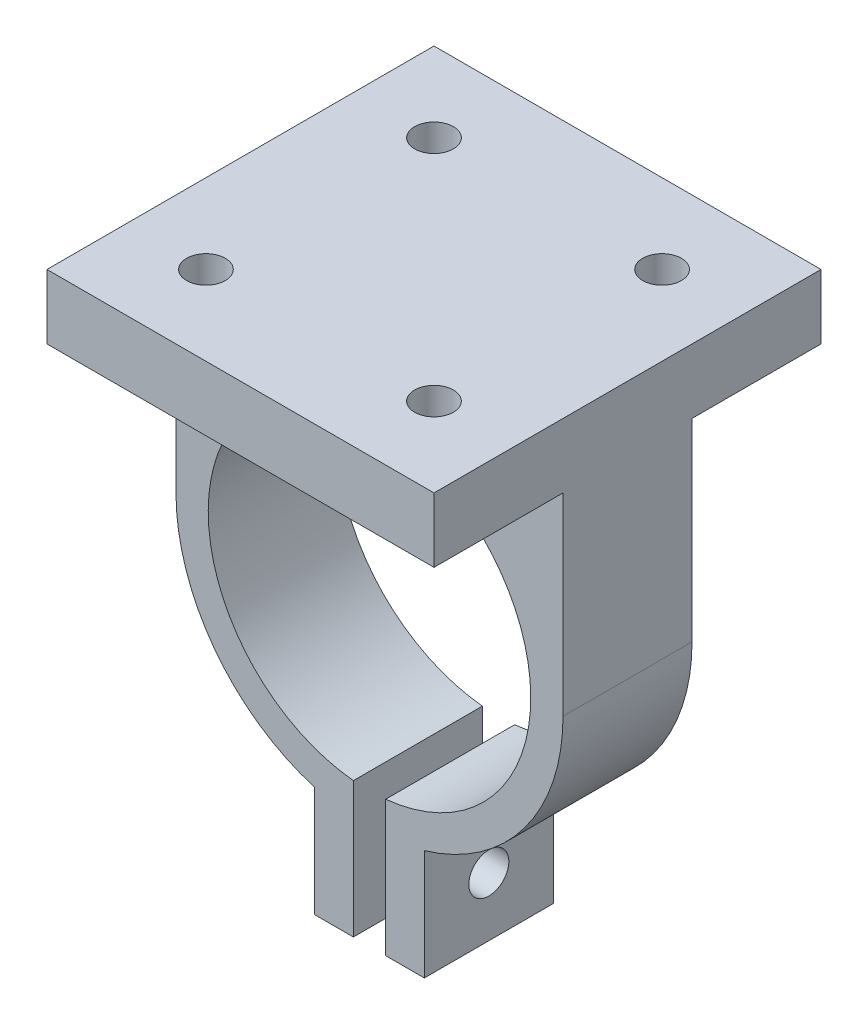
ISO-10303-21;
HEADER;
FILE_DESCRIPTION(('STEP AP214'),'2;1');
FILE_NAME('part.step','',(''),(''),'','','');
FILE_SCHEMA(('AUTOMOTIVE_DESIGN { 1 0 10303 214 1 1 1 1 }'));
ENDSEC;
DATA;
#1=APPLICATION_CONTEXT('core data for automotive mechanical design processes');
#2=APPLICATION_PROTOCOL_DEFINITION('international standard','automotive_design',2000,#1);
#3=PRODUCT_CONTEXT('',#1,'mechanical');
#4=PRODUCT('Part','Part','',(#3));
#5=PRODUCT_RELATED_PRODUCT_CATEGORY('part','',(#4));
#6=PRODUCT_DEFINITION_FORMATION('','',#4);
#7=PRODUCT_DEFINITION_CONTEXT('part definition',#1,'design');
#8=PRODUCT_DEFINITION('design','',#6,#7);
#9=PRODUCT_DEFINITION_SHAPE('','',#8);
#10=(LENGTH_UNIT() NAMED_UNIT(*) SI_UNIT(.MILLI.,.METRE.));
#11=(NAMED_UNIT(*) PLANE_ANGLE_UNIT() SI_UNIT($,.RADIAN.));
#12=(NAMED_UNIT(*) SI_UNIT($,.STERADIAN.) SOLID_ANGLE_UNIT());
#13=UNCERTAINTY_MEASURE_WITH_UNIT(LENGTH_MEASURE(1.E-05),#10,'distance_accuracy_value','');
#14=(GEOMETRIC_REPRESENTATION_CONTEXT(3) GLOBAL_UNCERTAINTY_ASSIGNED_CONTEXT((#13)) GLOBAL_UNIT_ASSIGNED_CONTEXT((#10,
#11,#12)) REPRESENTATION_CONTEXT('',''));
#15=CARTESIAN_POINT('',(0.,0.,0.));
#16=DIRECTION('',(0.,0.,1.));
#17=DIRECTION('',(1.,0.,0.));
#18=AXIS2_PLACEMENT_3D('',#15,#16,#17);
#19=CARTESIAN_POINT('',(0.,0.,5.));
#20=DIRECTION('',(0.,0.,-1.));
#21=DIRECTION('',(-1.,0.,0.));
#22=AXIS2_PLACEMENT_3D('',#19,#20,#21);
#23=CYLINDRICAL_SURFACE('',#22,15.);
#24=DIRECTION('',(0.,0.,-1.));
#25=VECTOR('',#24,1.);
#26=CARTESIAN_POINT('',(4.25,-14.3853223808158,5.));
#27=LINE('',#26,#25);
#28=CARTESIAN_POINT('',(4.25,-14.3853223808158,-5.));
#29=VERTEX_POINT('',#28);
#30=CARTESIAN_POINT('',(4.25,-14.3853223808158,5.));
#31=VERTEX_POINT('',#30);
#32=EDGE_CURVE('E277',#29,#31,#27,.F.);
#33=ORIENTED_EDGE('',*,*,#32,.F.);
#34=CARTESIAN_POINT('',(0.,0.,-5.));
#35=DIRECTION('',(0.,0.,1.));
#36=DIRECTION('',(1.,0.,0.));
#37=AXIS2_PLACEMENT_3D('',#34,#35,#36);
#38=CIRCLE('',#37,15.);
#39=CARTESIAN_POINT('',(15.,0.,-5.));
#40=VERTEX_POINT('',#39);
#41=EDGE_CURVE('E348',#29,#40,#38,.T.);
#42=ORIENTED_EDGE('',*,*,#41,.T.);
#43=DIRECTION('',(0.,0.,-1.));
#44=VECTOR('',#43,1.);
#45=CARTESIAN_POINT('',(15.,0.,5.));
#46=LINE('',#45,#44);
#47=CARTESIAN_POINT('',(15.,0.,5.));
#48=VERTEX_POINT('',#47);
#49=EDGE_CURVE('E340',#48,#40,#46,.T.);
#50=ORIENTED_EDGE('',*,*,#49,.F.);
#51=CARTESIAN_POINT('',(0.,0.,5.));
#52=DIRECTION('',(0.,0.,1.));
#53=DIRECTION('',(1.,0.,0.));
#54=AXIS2_PLACEMENT_3D('',#51,#52,#53);
#55=CIRCLE('',#54,15.);
#56=EDGE_CURVE('E59',#31,#48,#55,.T.);
#57=ORIENTED_EDGE('',*,*,#56,.F.);
#58=EDGE_LOOP('',(#33,#42,#50,#57));
#59=FACE_BOUND('',#58,.T.);
#60=ADVANCED_FACE('F43',(#59),#23,.T.);
#61=DIRECTION('',(0.,0.,-1.));
#62=VECTOR('',#61,1.);
#63=CARTESIAN_POINT('',(-4.25,-14.3853223808158,5.));
#64=LINE('',#63,#62);
#65=CARTESIAN_POINT('',(-4.25,-14.3853223808158,5.));
#66=VERTEX_POINT('',#65);
#67=CARTESIAN_POINT('',(-4.25,-14.3853223808158,-5.));
#68=VERTEX_POINT('',#67);
#69=EDGE_CURVE('E67',#66,#68,#64,.T.);
#70=ORIENTED_EDGE('',*,*,#69,.F.);
#71=CARTESIAN_POINT('',(-15.,0.,5.));
#72=VERTEX_POINT('',#71);
#73=EDGE_CURVE('E308',#72,#66,#55,.T.);
#74=ORIENTED_EDGE('',*,*,#73,.F.);
#75=DIRECTION('',(0.,0.,-1.));
#76=VECTOR('',#75,1.);
#77=CARTESIAN_POINT('',(-15.,0.,5.));
#78=LINE('',#77,#76);
#79=CARTESIAN_POINT('',(-15.,0.,-5.));
#80=VERTEX_POINT('',#79);
#81=EDGE_CURVE('E12',#72,#80,#78,.T.);
#82=ORIENTED_EDGE('',*,*,#81,.T.);
#83=EDGE_CURVE('E344',#80,#68,#38,.T.);
#84=ORIENTED_EDGE('',*,*,#83,.T.);
#85=EDGE_LOOP('',(#70,#74,#82,#84));
#86=FACE_BOUND('',#85,.T.);
#87=ADVANCED_FACE('F464',(#86),#23,.T.);
#88=CARTESIAN_POINT('',(-15.,0.,5.));
#89=DIRECTION('',(-1.,0.,0.));
#90=DIRECTION('',(0.,0.,1.));
#91=AXIS2_PLACEMENT_3D('',#88,#89,#90);
#92=PLANE('',#91);
#93=DIRECTION('',(0.,1.,0.));
#94=VECTOR('',#93,1.);
#95=CARTESIAN_POINT('',(-15.,0.,-5.));
#96=LINE('',#95,#94);
#97=CARTESIAN_POINT('',(-15.,15.,-5.));
#98=VERTEX_POINT('',#97);
#99=EDGE_CURVE('E304',#80,#98,#96,.T.);
#100=ORIENTED_EDGE('',*,*,#99,.F.);
#101=ORIENTED_EDGE('',*,*,#81,.F.);
#102=DIRECTION('',(0.,1.,0.));
#103=VECTOR('',#102,1.);
#104=CARTESIAN_POINT('',(-15.,0.,5.));
#105=LINE('',#104,#103);
#106=CARTESIAN_POINT('',(-15.,15.,5.));
#107=VERTEX_POINT('',#106);
#108=EDGE_CURVE('E305',#72,#107,#105,.T.);
#109=ORIENTED_EDGE('',*,*,#108,.T.);
#110=DIRECTION('',(0.,0.,1.));
#111=VECTOR('',#110,1.);
#112=CARTESIAN_POINT('',(-15.,15.,0.));
#113=LINE('',#112,#111);
#114=CARTESIAN_POINT('',(-15.,15.,15.));
#115=VERTEX_POINT('',#114);
#116=EDGE_CURVE('E216',#107,#115,#113,.T.);
#117=ORIENTED_EDGE('',*,*,#116,.T.);
#118=DIRECTION('',(0.,-1.,0.));
#119=VECTOR('',#118,1.);
#120=CARTESIAN_POINT('',(-15.,20.,15.));
#121=LINE('',#120,#119);
#122=CARTESIAN_POINT('',(-15.,20.,15.));
#123=VERTEX_POINT('',#122);
#124=EDGE_CURVE('E230',#123,#115,#121,.T.);
#125=ORIENTED_EDGE('',*,*,#124,.F.);
#126=DIRECTION('',(0.,0.,1.));
#127=VECTOR('',#126,1.);
#128=CARTESIAN_POINT('',(-15.,20.,0.));
#129=LINE('',#128,#127);
#130=CARTESIAN_POINT('',(-15.,20.,-15.));
#131=VERTEX_POINT('',#130);
#132=EDGE_CURVE('E167',#131,#123,#129,.T.);
#133=ORIENTED_EDGE('',*,*,#132,.F.);
#134=DIRECTION('',(0.,-1.,0.));
#135=VECTOR('',#134,1.);
#136=CARTESIAN_POINT('',(-15.,20.,-15.));
#137=LINE('',#136,#135);
#138=CARTESIAN_POINT('',(-15.,15.,-15.));
#139=VERTEX_POINT('',#138);
#140=EDGE_CURVE('E234',#131,#139,#137,.T.);
#141=ORIENTED_EDGE('',*,*,#140,.T.);
#142=EDGE_CURVE('E217',#139,#98,#113,.T.);
#143=ORIENTED_EDGE('',*,*,#142,.T.);
#144=EDGE_LOOP('',(#100,#101,#109,#117,#125,#133,#141,#143));
#145=FACE_BOUND('',#144,.T.);
#146=ADVANCED_FACE('F45',(#145),#92,.T.);
#147=CARTESIAN_POINT('',(-1.25,0.,5.));
#148=DIRECTION('',(-1.,0.,0.));
#149=DIRECTION('',(0.,-1.,0.));
#150=AXIS2_PLACEMENT_3D('',#147,#148,#149);
#151=PLANE('',#150);
#152=CARTESIAN_POINT('',(-1.25,-18.3853223808158,0.));
#153=DIRECTION('',(-1.,0.,0.));
#154=DIRECTION('',(0.,-1.,0.));
#155=AXIS2_PLACEMENT_3D('',#152,#153,#154);
#156=CIRCLE('',#155,1.55);
#157=CARTESIAN_POINT('',(-1.25,-19.9353223808158,0.));
#158=VERTEX_POINT('',#157);
#159=EDGE_CURVE('E251',#158,#158,#156,.T.);
#160=ORIENTED_EDGE('',*,*,#159,.T.);
#161=EDGE_LOOP('',(#160));
#162=FACE_BOUND('',#161,.T.);
#163=DIRECTION('',(0.,1.,0.));
#164=VECTOR('',#163,1.);
#165=CARTESIAN_POINT('',(-1.25,0.,-5.));
#166=LINE('',#165,#164);
#167=CARTESIAN_POINT('',(-1.25,-22.9373429638327,-5.));
#168=VERTEX_POINT('',#167);
#169=CARTESIAN_POINT('',(-1.25,-12.4373429638328,-5.));
#170=VERTEX_POINT('',#169);
#171=EDGE_CURVE('E347',#168,#170,#166,.T.);
#172=ORIENTED_EDGE('',*,*,#171,.T.);
#173=DIRECTION('',(0.,0.,-1.));
#174=VECTOR('',#173,1.);
#175=CARTESIAN_POINT('',(-1.25,-12.4373429638328,5.));
#176=LINE('',#175,#174);
#177=CARTESIAN_POINT('',(-1.25,-12.4373429638328,5.));
#178=VERTEX_POINT('',#177);
#179=EDGE_CURVE('E52',#178,#170,#176,.T.);
#180=ORIENTED_EDGE('',*,*,#179,.F.);
#181=DIRECTION('',(0.,1.,0.));
#182=VECTOR('',#181,1.);
#183=CARTESIAN_POINT('',(-1.25,0.,5.));
#184=LINE('',#183,#182);
#185=CARTESIAN_POINT('',(-1.25,-22.9373429638327,5.));
#186=VERTEX_POINT('',#185);
#187=EDGE_CURVE('E313',#186,#178,#184,.T.);
#188=ORIENTED_EDGE('',*,*,#187,.F.);
#189=DIRECTION('',(0.,0.,-1.));
#190=VECTOR('',#189,1.);
#191=CARTESIAN_POINT('',(-1.25,-22.9373429638327,5.));
#192=LINE('',#191,#190);
#193=EDGE_CURVE('E289',#186,#168,#192,.T.);
#194=ORIENTED_EDGE('',*,*,#193,.T.);
#195=EDGE_LOOP('',(#172,#180,#188,#194));
#196=FACE_BOUND('',#195,.T.);
#197=ADVANCED_FACE('F379',(#162,#196),#151,.F.);
#198=CARTESIAN_POINT('',(0.,0.,5.));
#199=DIRECTION('',(0.,0.,-1.));
#200=DIRECTION('',(-1.,0.,0.));
#201=AXIS2_PLACEMENT_3D('',#198,#199,#200);
#202=CYLINDRICAL_SURFACE('',#201,12.5);
#203=CARTESIAN_POINT('',(0.,0.,-5.));
#204=DIRECTION('',(0.,0.,1.));
#205=DIRECTION('',(1.,0.,0.));
#206=AXIS2_PLACEMENT_3D('',#203,#204,#205);
#207=CIRCLE('',#206,12.5);
#208=CARTESIAN_POINT('',(1.25,-12.4373429638328,-5.));
#209=VERTEX_POINT('',#208);
#210=EDGE_CURVE('E351',#209,#170,#207,.T.);
#211=ORIENTED_EDGE('',*,*,#210,.F.);
#212=DIRECTION('',(0.,0.,-1.));
#213=VECTOR('',#212,1.);
#214=CARTESIAN_POINT('',(1.25,-12.4373429638328,5.));
#215=LINE('',#214,#213);
#216=CARTESIAN_POINT('',(1.25,-12.4373429638328,5.));
#217=VERTEX_POINT('',#216);
#218=EDGE_CURVE('E370',#217,#209,#215,.T.);
#219=ORIENTED_EDGE('',*,*,#218,.F.);
#220=CARTESIAN_POINT('',(0.,0.,5.));
#221=DIRECTION('',(0.,0.,1.));
#222=DIRECTION('',(1.,0.,0.));
#223=AXIS2_PLACEMENT_3D('',#220,#221,#222);
#224=CIRCLE('',#223,12.5);
#225=EDGE_CURVE('E323',#217,#178,#224,.T.);
#226=ORIENTED_EDGE('',*,*,#225,.T.);
#227=ORIENTED_EDGE('',*,*,#179,.T.);
#228=EDGE_LOOP('',(#211,#219,#226,#227));
#229=FACE_BOUND('',#228,.T.);
#230=ADVANCED_FACE('F376',(#229),#202,.F.);
#231=CARTESIAN_POINT('',(1.25,0.,5.));
#232=DIRECTION('',(-1.,0.,0.));
#233=DIRECTION('',(0.,0.,1.));
#234=AXIS2_PLACEMENT_3D('',#231,#232,#233);
#235=PLANE('',#234);
#236=CARTESIAN_POINT('',(1.25,-18.3853223808158,0.));
#237=DIRECTION('',(-1.,0.,0.));
#238=DIRECTION('',(0.,0.,1.));
#239=AXIS2_PLACEMENT_3D('',#236,#237,#238);
#240=CIRCLE('',#239,1.55);
#241=CARTESIAN_POINT('',(1.25,-18.3853223808158,1.55));
#242=VERTEX_POINT('',#241);
#243=EDGE_CURVE('E247',#242,#242,#240,.T.);
#244=ORIENTED_EDGE('',*,*,#243,.F.);
#245=EDGE_LOOP('',(#244));
#246=FACE_BOUND('',#245,.T.);
#247=DIRECTION('',(0.,1.,0.));
#248=VECTOR('',#247,1.);
#249=CARTESIAN_POINT('',(1.25,0.,-5.));
#250=LINE('',#249,#248);
#251=CARTESIAN_POINT('',(1.25,-22.9373429638327,-5.));
#252=VERTEX_POINT('',#251);
#253=EDGE_CURVE('E356',#252,#209,#250,.T.);
#254=ORIENTED_EDGE('',*,*,#253,.F.);
#255=DIRECTION('',(0.,0.,-1.));
#256=VECTOR('',#255,1.);
#257=CARTESIAN_POINT('',(1.25,-22.9373429638327,5.));
#258=LINE('',#257,#256);
#259=CARTESIAN_POINT('',(1.25,-22.9373429638327,5.));
#260=VERTEX_POINT('',#259);
#261=EDGE_CURVE('E273',#260,#252,#258,.T.);
#262=ORIENTED_EDGE('',*,*,#261,.F.);
#263=DIRECTION('',(0.,1.,0.));
#264=VECTOR('',#263,1.);
#265=CARTESIAN_POINT('',(1.25,0.,5.));
#266=LINE('',#265,#264);
#267=EDGE_CURVE('E328',#260,#217,#266,.T.);
#268=ORIENTED_EDGE('',*,*,#267,.T.);
#269=ORIENTED_EDGE('',*,*,#218,.T.);
#270=EDGE_LOOP('',(#254,#262,#268,#269));
#271=FACE_BOUND('',#270,.T.);
#272=ADVANCED_FACE('F388',(#246,#271),#235,.T.);
#273=CARTESIAN_POINT('',(15.,0.,5.));
#274=DIRECTION('',(1.,0.,0.));
#275=DIRECTION('',(0.,0.,-1.));
#276=AXIS2_PLACEMENT_3D('',#273,#274,#275);
#277=PLANE('',#276);
#278=DIRECTION('',(0.,-1.,0.));
#279=VECTOR('',#278,1.);
#280=CARTESIAN_POINT('',(15.,0.,-5.));
#281=LINE('',#280,#279);
#282=CARTESIAN_POINT('',(15.,15.,-5.));
#283=VERTEX_POINT('',#282);
#284=EDGE_CURVE('E359',#283,#40,#281,.T.);
#285=ORIENTED_EDGE('',*,*,#284,.F.);
#286=DIRECTION('',(0.,0.,1.));
#287=VECTOR('',#286,1.);
#288=CARTESIAN_POINT('',(15.,15.,0.));
#289=LINE('',#288,#287);
#290=CARTESIAN_POINT('',(15.,15.,-15.));
#291=VERTEX_POINT('',#290);
#292=EDGE_CURVE('E204',#291,#283,#289,.T.);
#293=ORIENTED_EDGE('',*,*,#292,.F.);
#294=DIRECTION('',(0.,-1.,0.));
#295=VECTOR('',#294,1.);
#296=CARTESIAN_POINT('',(15.,20.,-15.));
#297=LINE('',#296,#295);
#298=CARTESIAN_POINT('',(15.,20.,-15.));
#299=VERTEX_POINT('',#298);
#300=EDGE_CURVE('E184',#299,#291,#297,.T.);
#301=ORIENTED_EDGE('',*,*,#300,.F.);
#302=DIRECTION('',(0.,0.,1.));
#303=VECTOR('',#302,1.);
#304=CARTESIAN_POINT('',(15.,20.,0.));
#305=LINE('',#304,#303);
#306=CARTESIAN_POINT('',(15.,20.,15.));
#307=VERTEX_POINT('',#306);
#308=EDGE_CURVE('E164',#299,#307,#305,.T.);
#309=ORIENTED_EDGE('',*,*,#308,.T.);
#310=DIRECTION('',(0.,-1.,0.));
#311=VECTOR('',#310,1.);
#312=CARTESIAN_POINT('',(15.,20.,15.));
#313=LINE('',#312,#311);
#314=CARTESIAN_POINT('',(15.,15.,15.));
#315=VERTEX_POINT('',#314);
#316=EDGE_CURVE('E176',#307,#315,#313,.T.);
#317=ORIENTED_EDGE('',*,*,#316,.T.);
#318=CARTESIAN_POINT('',(15.,15.,5.));
#319=VERTEX_POINT('',#318);
#320=EDGE_CURVE('E210',#319,#315,#289,.T.);
#321=ORIENTED_EDGE('',*,*,#320,.F.);
#322=DIRECTION('',(0.,-1.,0.));
#323=VECTOR('',#322,1.);
#324=CARTESIAN_POINT('',(15.,0.,5.));
#325=LINE('',#324,#323);
#326=EDGE_CURVE('E332',#319,#48,#325,.T.);
#327=ORIENTED_EDGE('',*,*,#326,.T.);
#328=ORIENTED_EDGE('',*,*,#49,.T.);
#329=EDGE_LOOP('',(#285,#293,#301,#309,#317,#321,#327,#328));
#330=FACE_BOUND('',#329,.T.);
#331=ADVANCED_FACE('F186',(#330),#277,.T.);
#332=CARTESIAN_POINT('',(0.,0.,5.));
#333=DIRECTION('',(0.,0.,1.));
#334=DIRECTION('',(1.,0.,0.));
#335=AXIS2_PLACEMENT_3D('',#332,#333,#334);
#336=PLANE('',#335);
#337=ORIENTED_EDGE('',*,*,#267,.F.);
#338=DIRECTION('',(1.,0.,0.));
#339=VECTOR('',#338,1.);
#340=CARTESIAN_POINT('',(1.25,-22.9373429638327,5.));
#341=LINE('',#340,#339);
#342=CARTESIAN_POINT('',(4.25,-22.9373429638327,5.));
#343=VERTEX_POINT('',#342);
#344=EDGE_CURVE('E256',#260,#343,#341,.T.);
#345=ORIENTED_EDGE('',*,*,#344,.T.);
#346=DIRECTION('',(0.,1.,0.));
#347=VECTOR('',#346,1.);
#348=CARTESIAN_POINT('',(4.25,-12.4373429638327,5.));
#349=LINE('',#348,#347);
#350=EDGE_CURVE('E259',#343,#31,#349,.T.);
#351=ORIENTED_EDGE('',*,*,#350,.T.);
#352=ORIENTED_EDGE('',*,*,#56,.T.);
#353=ORIENTED_EDGE('',*,*,#326,.F.);
#354=DIRECTION('',(1.,0.,0.));
#355=VECTOR('',#354,1.);
#356=CARTESIAN_POINT('',(0.,15.,5.));
#357=LINE('',#356,#355);
#358=EDGE_CURVE('E336',#107,#319,#357,.T.);
#359=ORIENTED_EDGE('',*,*,#358,.F.);
#360=ORIENTED_EDGE('',*,*,#108,.F.);
#361=ORIENTED_EDGE('',*,*,#73,.T.);
#362=DIRECTION('',(0.,-1.,0.));
#363=VECTOR('',#362,1.);
#364=CARTESIAN_POINT('',(-4.25,-12.4373429638327,5.));
#365=LINE('',#364,#363);
#366=CARTESIAN_POINT('',(-4.25,-22.9373429638327,5.));
#367=VERTEX_POINT('',#366);
#368=EDGE_CURVE('E281',#66,#367,#365,.T.);
#369=ORIENTED_EDGE('',*,*,#368,.T.);
#370=DIRECTION('',(1.,0.,0.));
#371=VECTOR('',#370,1.);
#372=CARTESIAN_POINT('',(-1.25,-22.9373429638327,5.));
#373=LINE('',#372,#371);
#374=EDGE_CURVE('E284',#367,#186,#373,.T.);
#375=ORIENTED_EDGE('',*,*,#374,.T.);
#376=ORIENTED_EDGE('',*,*,#187,.T.);
#377=ORIENTED_EDGE('',*,*,#225,.F.);
#378=EDGE_LOOP('',(#337,#345,#351,#352,#353,#359,#360,#361,#369,#375,#376,#377));
#379=FACE_BOUND('',#378,.T.);
#380=ADVANCED_FACE('F390',(#379),#336,.T.);
#381=CARTESIAN_POINT('',(0.,0.,-5.));
#382=DIRECTION('',(0.,0.,1.));
#383=DIRECTION('',(1.,0.,0.));
#384=AXIS2_PLACEMENT_3D('',#381,#382,#383);
#385=PLANE('',#384);
#386=ORIENTED_EDGE('',*,*,#41,.F.);
#387=DIRECTION('',(0.,1.,0.));
#388=VECTOR('',#387,1.);
#389=CARTESIAN_POINT('',(4.25,-12.4373429638327,-5.));
#390=LINE('',#389,#388);
#391=CARTESIAN_POINT('',(4.25,-22.9373429638327,-5.));
#392=VERTEX_POINT('',#391);
#393=EDGE_CURVE('E260',#392,#29,#390,.T.);
#394=ORIENTED_EDGE('',*,*,#393,.F.);
#395=DIRECTION('',(1.,0.,0.));
#396=VECTOR('',#395,1.);
#397=CARTESIAN_POINT('',(1.25,-22.9373429638327,-5.));
#398=LINE('',#397,#396);
#399=EDGE_CURVE('E255',#252,#392,#398,.T.);
#400=ORIENTED_EDGE('',*,*,#399,.F.);
#401=ORIENTED_EDGE('',*,*,#253,.T.);
#402=ORIENTED_EDGE('',*,*,#210,.T.);
#403=ORIENTED_EDGE('',*,*,#171,.F.);
#404=DIRECTION('',(1.,0.,0.));
#405=VECTOR('',#404,1.);
#406=CARTESIAN_POINT('',(-1.25,-22.9373429638327,-5.));
#407=LINE('',#406,#405);
#408=CARTESIAN_POINT('',(-4.25,-22.9373429638327,-5.));
#409=VERTEX_POINT('',#408);
#410=EDGE_CURVE('E285',#409,#168,#407,.T.);
#411=ORIENTED_EDGE('',*,*,#410,.F.);
#412=DIRECTION('',(0.,-1.,0.));
#413=VECTOR('',#412,1.);
#414=CARTESIAN_POINT('',(-4.25,-12.4373429638327,-5.));
#415=LINE('',#414,#413);
#416=EDGE_CURVE('E280',#68,#409,#415,.T.);
#417=ORIENTED_EDGE('',*,*,#416,.F.);
#418=ORIENTED_EDGE('',*,*,#83,.F.);
#419=ORIENTED_EDGE('',*,*,#99,.T.);
#420=DIRECTION('',(1.,0.,0.));
#421=VECTOR('',#420,1.);
#422=CARTESIAN_POINT('',(0.,15.,-5.));
#423=LINE('',#422,#421);
#424=EDGE_CURVE('E309',#98,#283,#423,.T.);
#425=ORIENTED_EDGE('',*,*,#424,.T.);
#426=ORIENTED_EDGE('',*,*,#284,.T.);
#427=EDGE_LOOP('',(#386,#394,#400,#401,#402,#403,#411,#417,#418,#419,#425,#426));
#428=FACE_BOUND('',#427,.T.);
#429=ADVANCED_FACE('F383',(#428),#385,.F.);
#430=CARTESIAN_POINT('',(-4.25,-12.4373429638327,5.));
#431=DIRECTION('',(1.,0.,0.));
#432=DIRECTION('',(0.,1.,0.));
#433=AXIS2_PLACEMENT_3D('',#430,#431,#432);
#434=PLANE('',#433);
#435=CARTESIAN_POINT('',(-4.25,-18.3853223808158,0.));
#436=DIRECTION('',(-1.,0.,0.));
#437=DIRECTION('',(0.,-1.,0.));
#438=AXIS2_PLACEMENT_3D('',#435,#436,#437);
#439=CIRCLE('',#438,1.55);
#440=CARTESIAN_POINT('',(-4.25,-19.9353223808158,0.));
#441=VERTEX_POINT('',#440);
#442=EDGE_CURVE('E183',#441,#441,#439,.T.);
#443=ORIENTED_EDGE('',*,*,#442,.F.);
#444=EDGE_LOOP('',(#443));
#445=FACE_BOUND('',#444,.T.);
#446=ORIENTED_EDGE('',*,*,#368,.F.);
#447=ORIENTED_EDGE('',*,*,#69,.T.);
#448=ORIENTED_EDGE('',*,*,#416,.T.);
#449=DIRECTION('',(0.,0.,-1.));
#450=VECTOR('',#449,1.);
#451=CARTESIAN_POINT('',(-4.25,-22.9373429638327,5.));
#452=LINE('',#451,#450);
#453=EDGE_CURVE('E298',#367,#409,#452,.T.);
#454=ORIENTED_EDGE('',*,*,#453,.F.);
#455=EDGE_LOOP('',(#446,#447,#448,#454));
#456=FACE_BOUND('',#455,.T.);
#457=ADVANCED_FACE('F507',(#445,#456),#434,.F.);
#458=CARTESIAN_POINT('',(-1.25,-22.9373429638327,5.));
#459=DIRECTION('',(0.,1.,0.));
#460=DIRECTION('',(0.,0.,1.));
#461=AXIS2_PLACEMENT_3D('',#458,#459,#460);
#462=PLANE('',#461);
#463=ORIENTED_EDGE('',*,*,#410,.T.);
#464=ORIENTED_EDGE('',*,*,#193,.F.);
#465=ORIENTED_EDGE('',*,*,#374,.F.);
#466=ORIENTED_EDGE('',*,*,#453,.T.);
#467=EDGE_LOOP('',(#463,#464,#465,#466));
#468=FACE_BOUND('',#467,.T.);
#469=ADVANCED_FACE('F500',(#468),#462,.F.);
#470=CARTESIAN_POINT('',(4.25,-12.4373429638327,5.));
#471=DIRECTION('',(-1.,0.,0.));
#472=DIRECTION('',(0.,-1.,0.));
#473=AXIS2_PLACEMENT_3D('',#470,#471,#472);
#474=PLANE('',#473);
#475=CARTESIAN_POINT('',(4.25,-18.3853223808158,0.));
#476=DIRECTION('',(-1.,0.,0.));
#477=DIRECTION('',(0.,-1.,0.));
#478=AXIS2_PLACEMENT_3D('',#475,#476,#477);
#479=CIRCLE('',#478,1.55);
#480=CARTESIAN_POINT('',(4.25,-19.9353223808158,0.));
#481=VERTEX_POINT('',#480);
#482=EDGE_CURVE('E243',#481,#481,#479,.F.);
#483=ORIENTED_EDGE('',*,*,#482,.F.);
#484=EDGE_LOOP('',(#483));
#485=FACE_BOUND('',#484,.T.);
#486=ORIENTED_EDGE('',*,*,#393,.T.);
#487=ORIENTED_EDGE('',*,*,#32,.T.);
#488=ORIENTED_EDGE('',*,*,#350,.F.);
#489=DIRECTION('',(0.,0.,-1.));
#490=VECTOR('',#489,1.);
#491=CARTESIAN_POINT('',(4.25,-22.9373429638327,5.));
#492=LINE('',#491,#490);
#493=EDGE_CURVE('E264',#343,#392,#492,.T.);
#494=ORIENTED_EDGE('',*,*,#493,.T.);
#495=EDGE_LOOP('',(#486,#487,#488,#494));
#496=FACE_BOUND('',#495,.T.);
#497=ADVANCED_FACE('F497',(#485,#496),#474,.F.);
#498=CARTESIAN_POINT('',(1.25,-22.9373429638327,5.));
#499=DIRECTION('',(0.,1.,0.));
#500=DIRECTION('',(0.,0.,1.));
#501=AXIS2_PLACEMENT_3D('',#498,#499,#500);
#502=PLANE('',#501);
#503=ORIENTED_EDGE('',*,*,#399,.T.);
#504=ORIENTED_EDGE('',*,*,#493,.F.);
#505=ORIENTED_EDGE('',*,*,#344,.F.);
#506=ORIENTED_EDGE('',*,*,#261,.T.);
#507=EDGE_LOOP('',(#503,#504,#505,#506));
#508=FACE_BOUND('',#507,.T.);
#509=ADVANCED_FACE('F492',(#508),#502,.F.);
#510=CARTESIAN_POINT('',(8.63406204335659,-18.3853223808158,0.));
#511=DIRECTION('',(-1.,0.,0.));
#512=DIRECTION('',(0.,-1.,0.));
#513=AXIS2_PLACEMENT_3D('',#510,#511,#512);
#514=CYLINDRICAL_SURFACE('',#513,1.55);
#515=ORIENTED_EDGE('',*,*,#243,.T.);
#516=EDGE_LOOP('',(#515));
#517=FACE_BOUND('',#516,.T.);
#518=ORIENTED_EDGE('',*,*,#482,.T.);
#519=EDGE_LOOP('',(#518));
#520=FACE_BOUND('',#519,.T.);
#521=ADVANCED_FACE('F485',(#517,#520),#514,.F.);
#522=ORIENTED_EDGE('',*,*,#442,.T.);
#523=EDGE_LOOP('',(#522));
#524=FACE_BOUND('',#523,.T.);
#525=ORIENTED_EDGE('',*,*,#159,.F.);
#526=EDGE_LOOP('',(#525));
#527=FACE_BOUND('',#526,.T.);
#528=ADVANCED_FACE('F483',(#524,#527),#514,.F.);
#529=CARTESIAN_POINT('',(0.,15.,0.));
#530=DIRECTION('',(0.,1.,0.));
#531=DIRECTION('',(0.,0.,1.));
#532=AXIS2_PLACEMENT_3D('',#529,#530,#531);
#533=PLANE('',#532);
#534=CARTESIAN_POINT('',(8.83766952966369,15.,8.83766952966369));
#535=DIRECTION('',(0.,1.,0.));
#536=DIRECTION('',(0.,0.,1.));
#537=AXIS2_PLACEMENT_3D('',#534,#535,#536);
#538=CIRCLE('',#537,1.5);
#539=CARTESIAN_POINT('',(8.83766952966369,15.,10.3376695296637));
#540=VERTEX_POINT('',#539);
#541=EDGE_CURVE('E413',#540,#540,#538,.T.);
#542=ORIENTED_EDGE('',*,*,#541,.T.);
#543=EDGE_LOOP('',(#542));
#544=FACE_BOUND('',#543,.T.);
#545=CARTESIAN_POINT('',(-8.84,15.,8.83766952966369));
#546=DIRECTION('',(0.,1.,0.));
#547=DIRECTION('',(0.,0.,1.));
#548=AXIS2_PLACEMENT_3D('',#545,#546,#547);
#549=CIRCLE('',#548,1.5);
#550=CARTESIAN_POINT('',(-8.84,15.,10.3376695296637));
#551=VERTEX_POINT('',#550);
#552=EDGE_CURVE('E410',#551,#551,#549,.T.);
#553=ORIENTED_EDGE('',*,*,#552,.T.);
#554=EDGE_LOOP('',(#553));
#555=FACE_BOUND('',#554,.T.);
#556=ORIENTED_EDGE('',*,*,#116,.F.);
#557=ORIENTED_EDGE('',*,*,#358,.T.);
#558=ORIENTED_EDGE('',*,*,#320,.T.);
#559=DIRECTION('',(1.,0.,0.));
#560=VECTOR('',#559,1.);
#561=CARTESIAN_POINT('',(0.,15.,15.));
#562=LINE('',#561,#560);
#563=EDGE_CURVE('E179',#115,#315,#562,.T.);
#564=ORIENTED_EDGE('',*,*,#563,.F.);
#565=EDGE_LOOP('',(#556,#557,#558,#564));
#566=FACE_BOUND('',#565,.T.);
#567=ADVANCED_FACE('F422',(#544,#555,#566),#533,.F.);
#568=CARTESIAN_POINT('',(0.,20.,15.));
#569=DIRECTION('',(0.,0.,-1.));
#570=DIRECTION('',(-1.,0.,0.));
#571=AXIS2_PLACEMENT_3D('',#568,#569,#570);
#572=PLANE('',#571);
#573=ORIENTED_EDGE('',*,*,#563,.T.);
#574=ORIENTED_EDGE('',*,*,#316,.F.);
#575=DIRECTION('',(1.,0.,0.));
#576=VECTOR('',#575,1.);
#577=CARTESIAN_POINT('',(0.,20.,15.));
#578=LINE('',#577,#576);
#579=EDGE_CURVE('E158',#123,#307,#578,.T.);
#580=ORIENTED_EDGE('',*,*,#579,.F.);
#581=ORIENTED_EDGE('',*,*,#124,.T.);
#582=EDGE_LOOP('',(#573,#574,#580,#581));
#583=FACE_BOUND('',#582,.T.);
#584=ADVANCED_FACE('F177',(#583),#572,.F.);
#585=CARTESIAN_POINT('',(0.,20.,-15.));
#586=DIRECTION('',(0.,0.,-1.));
#587=DIRECTION('',(-1.,0.,0.));
#588=AXIS2_PLACEMENT_3D('',#585,#586,#587);
#589=PLANE('',#588);
#590=DIRECTION('',(1.,0.,0.));
#591=VECTOR('',#590,1.);
#592=CARTESIAN_POINT('',(0.,15.,-15.));
#593=LINE('',#592,#591);
#594=EDGE_CURVE('E209',#139,#291,#593,.T.);
#595=ORIENTED_EDGE('',*,*,#594,.F.);
#596=ORIENTED_EDGE('',*,*,#140,.F.);
#597=DIRECTION('',(1.,0.,0.));
#598=VECTOR('',#597,1.);
#599=CARTESIAN_POINT('',(0.,20.,-15.));
#600=LINE('',#599,#598);
#601=EDGE_CURVE('E189',#131,#299,#600,.T.);
#602=ORIENTED_EDGE('',*,*,#601,.T.);
#603=ORIENTED_EDGE('',*,*,#300,.T.);
#604=EDGE_LOOP('',(#595,#596,#602,#603));
#605=FACE_BOUND('',#604,.T.);
#606=ADVANCED_FACE('F434',(#605),#589,.T.);
#607=CARTESIAN_POINT('',(8.83766952966369,20.,-8.84));
#608=DIRECTION('',(0.,-1.,0.));
#609=DIRECTION('',(0.,0.,-1.));
#610=AXIS2_PLACEMENT_3D('',#607,#608,#609);
#611=CYLINDRICAL_SURFACE('',#610,1.5);
#612=CARTESIAN_POINT('',(8.83766952966369,20.,-8.84));
#613=DIRECTION('',(0.,1.,0.));
#614=DIRECTION('',(0.,0.,1.));
#615=AXIS2_PLACEMENT_3D('',#612,#613,#614);
#616=CIRCLE('',#615,1.5);
#617=CARTESIAN_POINT('',(8.83766952966369,20.,-7.34));
#618=VERTEX_POINT('',#617);
#619=EDGE_CURVE('E398',#618,#618,#616,.T.);
#620=ORIENTED_EDGE('',*,*,#619,.T.);
#621=EDGE_LOOP('',(#620));
#622=FACE_BOUND('',#621,.T.);
#623=CARTESIAN_POINT('',(8.83766952966369,15.,-8.84));
#624=DIRECTION('',(0.,1.,0.));
#625=DIRECTION('',(0.,0.,1.));
#626=AXIS2_PLACEMENT_3D('',#623,#624,#625);
#627=CIRCLE('',#626,1.5);
#628=CARTESIAN_POINT('',(8.83766952966369,15.,-7.34));
#629=VERTEX_POINT('',#628);
#630=EDGE_CURVE('E221',#629,#629,#627,.T.);
#631=ORIENTED_EDGE('',*,*,#630,.F.);
#632=EDGE_LOOP('',(#631));
#633=FACE_BOUND('',#632,.T.);
#634=ADVANCED_FACE('F674',(#622,#633),#611,.F.);
#635=CARTESIAN_POINT('',(8.83766952966369,20.,8.83766952966369));
#636=DIRECTION('',(0.,-1.,0.));
#637=DIRECTION('',(0.,0.,-1.));
#638=AXIS2_PLACEMENT_3D('',#635,#636,#637);
#639=CYLINDRICAL_SURFACE('',#638,1.5);
#640=CARTESIAN_POINT('',(8.83766952966369,20.,8.83766952966369));
#641=DIRECTION('',(0.,1.,0.));
#642=DIRECTION('',(0.,0.,1.));
#643=AXIS2_PLACEMENT_3D('',#640,#641,#642);
#644=CIRCLE('',#643,1.5);
#645=CARTESIAN_POINT('',(8.83766952966369,20.,10.3376695296637));
#646=VERTEX_POINT('',#645);
#647=EDGE_CURVE('E172',#646,#646,#644,.T.);
#648=ORIENTED_EDGE('',*,*,#647,.T.);
#649=EDGE_LOOP('',(#648));
#650=FACE_BOUND('',#649,.T.);
#651=ORIENTED_EDGE('',*,*,#541,.F.);
#652=EDGE_LOOP('',(#651));
#653=FACE_BOUND('',#652,.T.);
#654=ADVANCED_FACE('F447',(#650,#653),#639,.F.);
#655=CARTESIAN_POINT('',(-8.84,20.,8.83766952966369));
#656=DIRECTION('',(0.,-1.,0.));
#657=DIRECTION('',(0.,0.,-1.));
#658=AXIS2_PLACEMENT_3D('',#655,#656,#657);
#659=CYLINDRICAL_SURFACE('',#658,1.5);
#660=CARTESIAN_POINT('',(-8.84,20.,8.83766952966369));
#661=DIRECTION('',(0.,1.,0.));
#662=DIRECTION('',(0.,0.,1.));
#663=AXIS2_PLACEMENT_3D('',#660,#661,#662);
#664=CIRCLE('',#663,1.5);
#665=CARTESIAN_POINT('',(-8.84,20.,10.3376695296637));
#666=VERTEX_POINT('',#665);
#667=EDGE_CURVE('E229',#666,#666,#664,.T.);
#668=ORIENTED_EDGE('',*,*,#667,.T.);
#669=EDGE_LOOP('',(#668));
#670=FACE_BOUND('',#669,.T.);
#671=ORIENTED_EDGE('',*,*,#552,.F.);
#672=EDGE_LOOP('',(#671));
#673=FACE_BOUND('',#672,.T.);
#674=ADVANCED_FACE('F459',(#670,#673),#659,.F.);
#675=CARTESIAN_POINT('',(-8.84,20.,-8.84));
#676=DIRECTION('',(0.,-1.,0.));
#677=DIRECTION('',(0.,0.,-1.));
#678=AXIS2_PLACEMENT_3D('',#675,#676,#677);
#679=CYLINDRICAL_SURFACE('',#678,1.5);
#680=CARTESIAN_POINT('',(-8.84,20.,-8.84));
#681=DIRECTION('',(0.,1.,0.));
#682=DIRECTION('',(0.,0.,1.));
#683=AXIS2_PLACEMENT_3D('',#680,#681,#682);
#684=CIRCLE('',#683,1.5);
#685=CARTESIAN_POINT('',(-8.84,20.,-7.34));
#686=VERTEX_POINT('',#685);
#687=EDGE_CURVE('E235',#686,#686,#684,.T.);
#688=ORIENTED_EDGE('',*,*,#687,.T.);
#689=EDGE_LOOP('',(#688));
#690=FACE_BOUND('',#689,.T.);
#691=CARTESIAN_POINT('',(-8.84,15.,-8.84));
#692=DIRECTION('',(0.,1.,0.));
#693=DIRECTION('',(0.,0.,1.));
#694=AXIS2_PLACEMENT_3D('',#691,#692,#693);
#695=CIRCLE('',#694,1.5);
#696=CARTESIAN_POINT('',(-8.84,15.,-7.34));
#697=VERTEX_POINT('',#696);
#698=EDGE_CURVE('E225',#697,#697,#695,.T.);
#699=ORIENTED_EDGE('',*,*,#698,.F.);
#700=EDGE_LOOP('',(#699));
#701=FACE_BOUND('',#700,.T.);
#702=ADVANCED_FACE('F451',(#690,#701),#679,.F.);
#703=CARTESIAN_POINT('',(0.,20.,0.));
#704=DIRECTION('',(0.,1.,0.));
#705=DIRECTION('',(0.,0.,1.));
#706=AXIS2_PLACEMENT_3D('',#703,#704,#705);
#707=PLANE('',#706);
#708=ORIENTED_EDGE('',*,*,#667,.F.);
#709=EDGE_LOOP('',(#708));
#710=FACE_BOUND('',#709,.T.);
#711=ORIENTED_EDGE('',*,*,#647,.F.);
#712=EDGE_LOOP('',(#711));
#713=FACE_BOUND('',#712,.T.);
#714=ORIENTED_EDGE('',*,*,#579,.T.);
#715=ORIENTED_EDGE('',*,*,#308,.F.);
#716=ORIENTED_EDGE('',*,*,#601,.F.);
#717=ORIENTED_EDGE('',*,*,#132,.T.);
#718=EDGE_LOOP('',(#714,#715,#716,#717));
#719=FACE_BOUND('',#718,.T.);
#720=ORIENTED_EDGE('',*,*,#619,.F.);
#721=EDGE_LOOP('',(#720));
#722=FACE_BOUND('',#721,.T.);
#723=ORIENTED_EDGE('',*,*,#687,.F.);
#724=EDGE_LOOP('',(#723));
#725=FACE_BOUND('',#724,.T.);
#726=ADVANCED_FACE('F160',(#710,#713,#719,#722,#725),#707,.T.);
#727=ORIENTED_EDGE('',*,*,#424,.F.);
#728=ORIENTED_EDGE('',*,*,#142,.F.);
#729=ORIENTED_EDGE('',*,*,#594,.T.);
#730=ORIENTED_EDGE('',*,*,#292,.T.);
#731=EDGE_LOOP('',(#727,#728,#729,#730));
#732=FACE_BOUND('',#731,.T.);
#733=ORIENTED_EDGE('',*,*,#630,.T.);
#734=EDGE_LOOP('',(#733));
#735=FACE_BOUND('',#734,.T.);
#736=ORIENTED_EDGE('',*,*,#698,.T.);
#737=EDGE_LOOP('',(#736));
#738=FACE_BOUND('',#737,.T.);
#739=ADVANCED_FACE('F431',(#732,#735,#738),#533,.F.);
#740=CLOSED_SHELL('',(#60,#87,#146,#197,#230,#272,#331,#380,#429,#457,#469,#497,#509,#521,#528,
#567,#584,#606,#634,#654,#674,#702,#726,#739));
#741=MANIFOLD_SOLID_BREP('B2',#740);
#742=ADVANCED_BREP_SHAPE_REPRESENTATION('',(#18,#741),#14);
#743=SHAPE_DEFINITION_REPRESENTATION(#9,#742);
ENDSEC;
END-ISO-10303-21;
